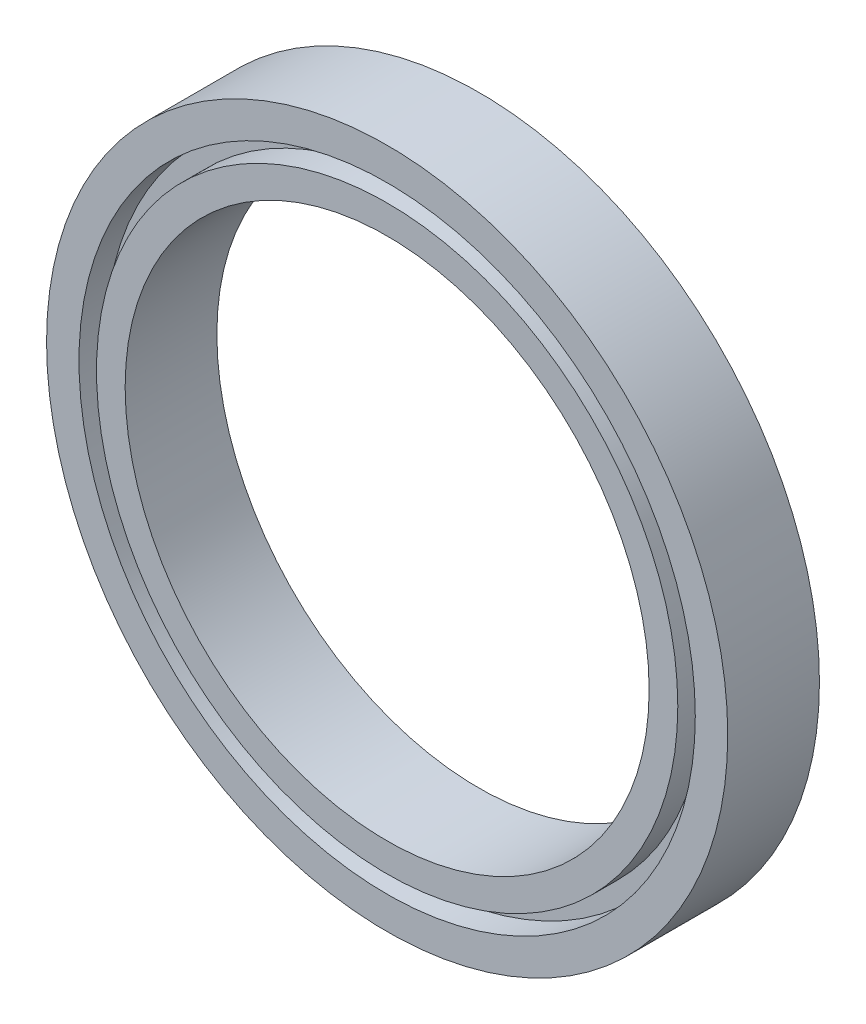
ISO-10303-21;
HEADER;
FILE_DESCRIPTION(('STEP AP214'),'2;1');
FILE_NAME('part.step','',(''),(''),'','','');
FILE_SCHEMA(('AUTOMOTIVE_DESIGN { 1 0 10303 214 1 1 1 1 }'));
ENDSEC;
DATA;
#1=APPLICATION_CONTEXT('core data for automotive mechanical design processes');
#2=APPLICATION_PROTOCOL_DEFINITION('international standard','automotive_design',2000,#1);
#3=PRODUCT_CONTEXT('',#1,'mechanical');
#4=PRODUCT('Part','Part','',(#3));
#5=PRODUCT_RELATED_PRODUCT_CATEGORY('part','',(#4));
#6=PRODUCT_DEFINITION_FORMATION('','',#4);
#7=PRODUCT_DEFINITION_CONTEXT('part definition',#1,'design');
#8=PRODUCT_DEFINITION('design','',#6,#7);
#9=PRODUCT_DEFINITION_SHAPE('','',#8);
#10=(LENGTH_UNIT() NAMED_UNIT(*) SI_UNIT(.MILLI.,.METRE.));
#11=(NAMED_UNIT(*) PLANE_ANGLE_UNIT() SI_UNIT($,.RADIAN.));
#12=(NAMED_UNIT(*) SI_UNIT($,.STERADIAN.) SOLID_ANGLE_UNIT());
#13=UNCERTAINTY_MEASURE_WITH_UNIT(LENGTH_MEASURE(1.E-05),#10,'distance_accuracy_value','');
#14=(GEOMETRIC_REPRESENTATION_CONTEXT(3) GLOBAL_UNCERTAINTY_ASSIGNED_CONTEXT((#13)) GLOBAL_UNIT_ASSIGNED_CONTEXT((#10,
#11,#12)) REPRESENTATION_CONTEXT('',''));
#15=CARTESIAN_POINT('',(0.,0.,0.));
#16=DIRECTION('',(0.,0.,1.));
#17=DIRECTION('',(1.,0.,0.));
#18=AXIS2_PLACEMENT_3D('',#15,#16,#17);
#19=CARTESIAN_POINT('',(0.,0.,3.5));
#20=DIRECTION('',(0.,0.,1.));
#21=DIRECTION('',(1.,0.,0.));
#22=AXIS2_PLACEMENT_3D('',#19,#20,#21);
#23=PLANE('',#22);
#24=CARTESIAN_POINT('',(0.,0.,3.5));
#25=DIRECTION('',(0.,0.,1.));
#26=DIRECTION('',(1.,0.,0.));
#27=AXIS2_PLACEMENT_3D('',#24,#25,#26);
#28=CIRCLE('',#27,20.);
#29=CARTESIAN_POINT('',(20.,0.,3.5));
#30=VERTEX_POINT('',#29);
#31=EDGE_CURVE('E42',#30,#30,#28,.T.);
#32=ORIENTED_EDGE('',*,*,#31,.F.);
#33=EDGE_LOOP('',(#32));
#34=FACE_BOUND('',#33,.T.);
#35=CARTESIAN_POINT('',(0.,0.,3.5));
#36=DIRECTION('',(0.,0.,1.));
#37=DIRECTION('',(1.,0.,0.));
#38=AXIS2_PLACEMENT_3D('',#35,#36,#37);
#39=CIRCLE('',#38,22.1870659312955);
#40=CARTESIAN_POINT('',(22.1870659312955,0.,3.5));
#41=VERTEX_POINT('',#40);
#42=EDGE_CURVE('E56',#41,#41,#39,.T.);
#43=ORIENTED_EDGE('',*,*,#42,.T.);
#44=EDGE_LOOP('',(#43));
#45=FACE_BOUND('',#44,.T.);
#46=ADVANCED_FACE('F31',(#34,#45),#23,.T.);
#47=CARTESIAN_POINT('',(0.,0.,3.5));
#48=DIRECTION('',(0.,0.,1.));
#49=DIRECTION('',(1.,0.,0.));
#50=AXIS2_PLACEMENT_3D('',#47,#48,#49);
#51=CIRCLE('',#50,23.5232759849356);
#52=CARTESIAN_POINT('',(23.5232759849356,0.,3.5));
#53=VERTEX_POINT('',#52);
#54=EDGE_CURVE('E50',#53,#53,#51,.T.);
#55=ORIENTED_EDGE('',*,*,#54,.F.);
#56=EDGE_LOOP('',(#55));
#57=FACE_BOUND('',#56,.T.);
#58=CARTESIAN_POINT('',(0.,0.,3.5));
#59=DIRECTION('',(0.,0.,1.));
#60=DIRECTION('',(1.,0.,0.));
#61=AXIS2_PLACEMENT_3D('',#58,#59,#60);
#62=CIRCLE('',#61,26.);
#63=CARTESIAN_POINT('',(26.,0.,3.5));
#64=VERTEX_POINT('',#63);
#65=EDGE_CURVE('E10',#64,#64,#62,.T.);
#66=ORIENTED_EDGE('',*,*,#65,.T.);
#67=EDGE_LOOP('',(#66));
#68=FACE_BOUND('',#67,.T.);
#69=ADVANCED_FACE('F78',(#57,#68),#23,.T.);
#70=CARTESIAN_POINT('',(0.,0.,-3.5));
#71=DIRECTION('',(0.,0.,1.));
#72=DIRECTION('',(1.,0.,0.));
#73=AXIS2_PLACEMENT_3D('',#70,#71,#72);
#74=PLANE('',#73);
#75=CARTESIAN_POINT('',(0.,0.,-3.5));
#76=DIRECTION('',(0.,0.,1.));
#77=DIRECTION('',(1.,0.,0.));
#78=AXIS2_PLACEMENT_3D('',#75,#76,#77);
#79=CIRCLE('',#78,26.);
#80=CARTESIAN_POINT('',(26.,0.,-3.5));
#81=VERTEX_POINT('',#80);
#82=EDGE_CURVE('E35',#81,#81,#79,.T.);
#83=ORIENTED_EDGE('',*,*,#82,.F.);
#84=EDGE_LOOP('',(#83));
#85=FACE_BOUND('',#84,.T.);
#86=CARTESIAN_POINT('',(0.,0.,-3.5));
#87=DIRECTION('',(0.,0.,1.));
#88=DIRECTION('',(1.,0.,0.));
#89=AXIS2_PLACEMENT_3D('',#86,#87,#88);
#90=CIRCLE('',#89,20.);
#91=CARTESIAN_POINT('',(20.,0.,-3.5));
#92=VERTEX_POINT('',#91);
#93=EDGE_CURVE('E44',#92,#92,#90,.T.);
#94=ORIENTED_EDGE('',*,*,#93,.T.);
#95=EDGE_LOOP('',(#94));
#96=FACE_BOUND('',#95,.T.);
#97=ADVANCED_FACE('F80',(#85,#96),#74,.F.);
#98=CARTESIAN_POINT('',(0.,0.,3.5));
#99=DIRECTION('',(0.,0.,-1.));
#100=DIRECTION('',(-1.,0.,0.));
#101=AXIS2_PLACEMENT_3D('',#98,#99,#100);
#102=CYLINDRICAL_SURFACE('',#101,26.);
#103=ORIENTED_EDGE('',*,*,#65,.F.);
#104=EDGE_LOOP('',(#103));
#105=FACE_BOUND('',#104,.T.);
#106=ORIENTED_EDGE('',*,*,#82,.T.);
#107=EDGE_LOOP('',(#106));
#108=FACE_BOUND('',#107,.T.);
#109=ADVANCED_FACE('F33',(#105,#108),#102,.T.);
#110=CARTESIAN_POINT('',(0.,0.,3.5));
#111=DIRECTION('',(0.,0.,-1.));
#112=DIRECTION('',(-1.,0.,0.));
#113=AXIS2_PLACEMENT_3D('',#110,#111,#112);
#114=CYLINDRICAL_SURFACE('',#113,20.);
#115=ORIENTED_EDGE('',*,*,#31,.T.);
#116=EDGE_LOOP('',(#115));
#117=FACE_BOUND('',#116,.T.);
#118=ORIENTED_EDGE('',*,*,#93,.F.);
#119=EDGE_LOOP('',(#118));
#120=FACE_BOUND('',#119,.T.);
#121=ADVANCED_FACE('F74',(#117,#120),#114,.F.);
#122=CARTESIAN_POINT('',(0.,0.,1.5));
#123=DIRECTION('',(0.,0.,1.));
#124=DIRECTION('',(1.,0.,0.));
#125=AXIS2_PLACEMENT_3D('',#122,#123,#124);
#126=CYLINDRICAL_SURFACE('',#125,23.5232759849356);
#127=CARTESIAN_POINT('',(0.,0.,1.5));
#128=DIRECTION('',(0.,0.,1.));
#129=DIRECTION('',(1.,0.,0.));
#130=AXIS2_PLACEMENT_3D('',#127,#128,#129);
#131=CIRCLE('',#130,23.5232759849356);
#132=CARTESIAN_POINT('',(23.5232759849356,0.,1.5));
#133=VERTEX_POINT('',#132);
#134=EDGE_CURVE('E47',#133,#133,#131,.T.);
#135=ORIENTED_EDGE('',*,*,#134,.F.);
#136=EDGE_LOOP('',(#135));
#137=FACE_BOUND('',#136,.T.);
#138=ORIENTED_EDGE('',*,*,#54,.T.);
#139=EDGE_LOOP('',(#138));
#140=FACE_BOUND('',#139,.T.);
#141=ADVANCED_FACE('F68',(#137,#140),#126,.F.);
#142=CARTESIAN_POINT('',(0.,0.,1.5));
#143=DIRECTION('',(0.,0.,1.));
#144=DIRECTION('',(1.,0.,0.));
#145=AXIS2_PLACEMENT_3D('',#142,#143,#144);
#146=PLANE('',#145);
#147=CARTESIAN_POINT('',(0.,0.,1.5));
#148=DIRECTION('',(0.,0.,1.));
#149=DIRECTION('',(1.,0.,0.));
#150=AXIS2_PLACEMENT_3D('',#147,#148,#149);
#151=CIRCLE('',#150,22.1870659312955);
#152=CARTESIAN_POINT('',(22.1870659312955,0.,1.5));
#153=VERTEX_POINT('',#152);
#154=EDGE_CURVE('E53',#153,#153,#151,.T.);
#155=ORIENTED_EDGE('',*,*,#154,.F.);
#156=EDGE_LOOP('',(#155));
#157=FACE_BOUND('',#156,.T.);
#158=ORIENTED_EDGE('',*,*,#134,.T.);
#159=EDGE_LOOP('',(#158));
#160=FACE_BOUND('',#159,.T.);
#161=ADVANCED_FACE('F65',(#157,#160),#146,.T.);
#162=CARTESIAN_POINT('',(0.,0.,1.5));
#163=DIRECTION('',(0.,0.,1.));
#164=DIRECTION('',(1.,0.,0.));
#165=AXIS2_PLACEMENT_3D('',#162,#163,#164);
#166=CYLINDRICAL_SURFACE('',#165,22.1870659312955);
#167=ORIENTED_EDGE('',*,*,#154,.T.);
#168=EDGE_LOOP('',(#167));
#169=FACE_BOUND('',#168,.T.);
#170=ORIENTED_EDGE('',*,*,#42,.F.);
#171=EDGE_LOOP('',(#170));
#172=FACE_BOUND('',#171,.T.);
#173=ADVANCED_FACE('F62',(#169,#172),#166,.T.);
#174=CLOSED_SHELL('',(#46,#69,#97,#109,#121,#141,#161,#173));
#175=MANIFOLD_SOLID_BREP('B2',#174);
#176=ADVANCED_BREP_SHAPE_REPRESENTATION('',(#18,#175),#14);
#177=SHAPE_DEFINITION_REPRESENTATION(#9,#176);
ENDSEC;
END-ISO-10303-21;
